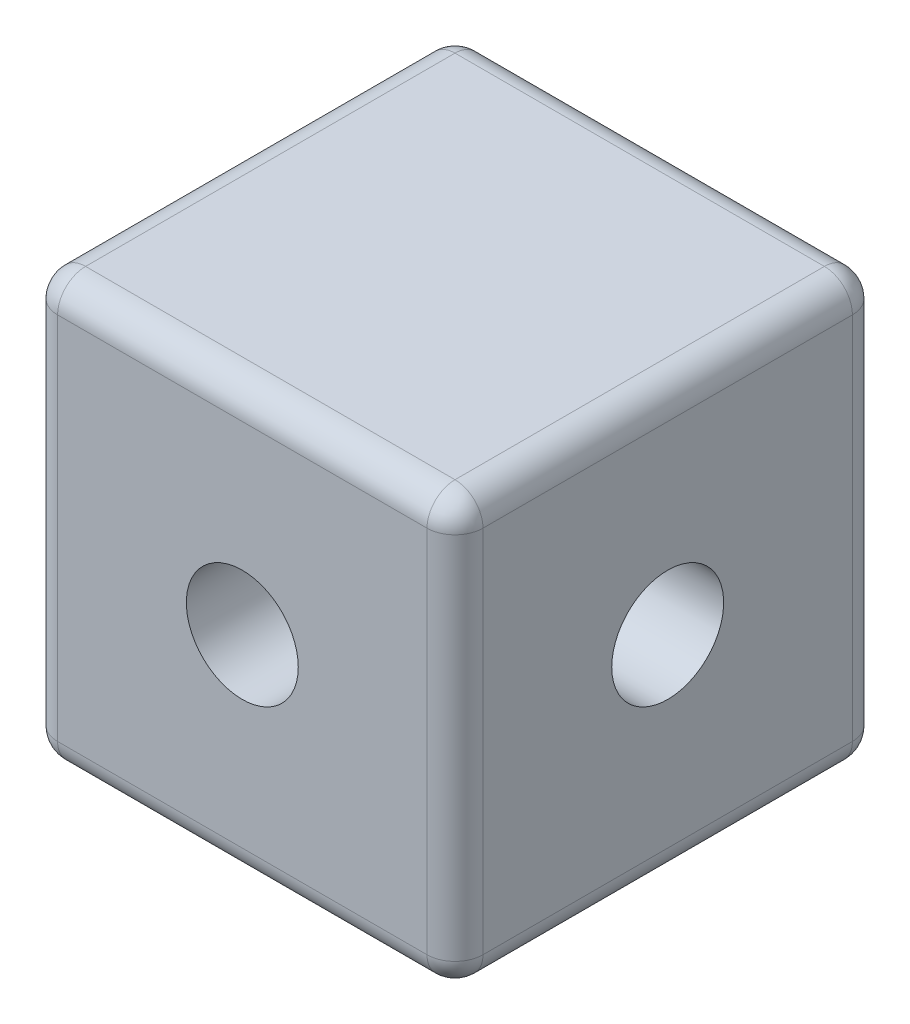
ISO-10303-21;
HEADER;
FILE_DESCRIPTION(('STEP AP214'),'2;1');
FILE_NAME('part.step','',(''),(''),'','','');
FILE_SCHEMA(('AUTOMOTIVE_DESIGN { 1 0 10303 214 1 1 1 1 }'));
ENDSEC;
DATA;
#1=APPLICATION_CONTEXT('core data for automotive mechanical design processes');
#2=APPLICATION_PROTOCOL_DEFINITION('international standard','automotive_design',2000,#1);
#3=PRODUCT_CONTEXT('',#1,'mechanical');
#4=PRODUCT('Part','Part','',(#3));
#5=PRODUCT_RELATED_PRODUCT_CATEGORY('part','',(#4));
#6=PRODUCT_DEFINITION_FORMATION('','',#4);
#7=PRODUCT_DEFINITION_CONTEXT('part definition',#1,'design');
#8=PRODUCT_DEFINITION('design','',#6,#7);
#9=PRODUCT_DEFINITION_SHAPE('','',#8);
#10=(LENGTH_UNIT() NAMED_UNIT(*) SI_UNIT(.MILLI.,.METRE.));
#11=(NAMED_UNIT(*) PLANE_ANGLE_UNIT() SI_UNIT($,.RADIAN.));
#12=(NAMED_UNIT(*) SI_UNIT($,.STERADIAN.) SOLID_ANGLE_UNIT());
#13=UNCERTAINTY_MEASURE_WITH_UNIT(LENGTH_MEASURE(1.E-05),#10,'distance_accuracy_value','');
#14=(GEOMETRIC_REPRESENTATION_CONTEXT(3) GLOBAL_UNCERTAINTY_ASSIGNED_CONTEXT((#13)) GLOBAL_UNIT_ASSIGNED_CONTEXT((#10,
#11,#12)) REPRESENTATION_CONTEXT('',''));
#15=CARTESIAN_POINT('',(0.,0.,0.));
#16=DIRECTION('',(0.,0.,1.));
#17=DIRECTION('',(1.,0.,0.));
#18=AXIS2_PLACEMENT_3D('',#15,#16,#17);
#19=CARTESIAN_POINT('',(6.2,3.8,0.));
#20=DIRECTION('',(-1.,0.,0.));
#21=DIRECTION('',(0.,0.,1.));
#22=AXIS2_PLACEMENT_3D('',#19,#20,#21);
#23=CYLINDRICAL_SURFACE('',#22,1.);
#24=CARTESIAN_POINT('',(-3.8,3.8,0.));
#25=DIRECTION('',(-1.,0.,0.));
#26=DIRECTION('',(0.,0.,1.));
#27=AXIS2_PLACEMENT_3D('',#24,#25,#26);
#28=CIRCLE('',#27,1.);
#29=CARTESIAN_POINT('',(-3.8,3.8,1.));
#30=VERTEX_POINT('',#29);
#31=EDGE_CURVE('E327',#30,#30,#28,.T.);
#32=ORIENTED_EDGE('',*,*,#31,.T.);
#33=EDGE_LOOP('',(#32));
#34=FACE_BOUND('',#33,.T.);
#35=CARTESIAN_POINT('',(0.,3.8,0.));
#36=DIRECTION('',(-0.707106781186547,0.,-0.707106781186547));
#37=DIRECTION('',(-0.707106781186547,0.,0.707106781186547));
#38=AXIS2_PLACEMENT_3D('',#35,#36,#37);
#39=ELLIPSE('',#38,1.41421356237309,1.);
#40=CARTESIAN_POINT('',(0.,4.8,0.));
#41=VERTEX_POINT('',#40);
#42=CARTESIAN_POINT('',(0.,2.8,0.));
#43=VERTEX_POINT('',#42);
#44=EDGE_CURVE('E59',#41,#43,#39,.F.);
#45=ORIENTED_EDGE('',*,*,#44,.T.);
#46=CARTESIAN_POINT('',(0.,3.8,0.));
#47=DIRECTION('',(-0.707106781186547,0.,0.707106781186547));
#48=DIRECTION('',(-0.707106781186547,0.,-0.707106781186547));
#49=AXIS2_PLACEMENT_3D('',#46,#47,#48);
#50=ELLIPSE('',#49,1.41421356237309,1.);
#51=EDGE_CURVE('E11',#43,#41,#50,.F.);
#52=ORIENTED_EDGE('',*,*,#51,.T.);
#53=EDGE_LOOP('',(#45,#52));
#54=FACE_BOUND('',#53,.T.);
#55=ADVANCED_FACE('F45',(#34,#54),#23,.F.);
#56=CARTESIAN_POINT('',(3.8,7.6,3.8));
#57=DIRECTION('',(-1.,0.,0.));
#58=DIRECTION('',(0.,0.,1.));
#59=AXIS2_PLACEMENT_3D('',#56,#57,#58);
#60=PLANE('',#59);
#61=CARTESIAN_POINT('',(3.8,3.8,0.));
#62=DIRECTION('',(-1.,0.,0.));
#63=DIRECTION('',(0.,0.,1.));
#64=AXIS2_PLACEMENT_3D('',#61,#62,#63);
#65=CIRCLE('',#64,1.);
#66=CARTESIAN_POINT('',(3.8,3.8,1.));
#67=VERTEX_POINT('',#66);
#68=EDGE_CURVE('E249',#67,#67,#65,.T.);
#69=ORIENTED_EDGE('',*,*,#68,.T.);
#70=EDGE_LOOP('',(#69));
#71=FACE_BOUND('',#70,.T.);
#72=DIRECTION('',(0.,-1.,0.));
#73=VECTOR('',#72,1.);
#74=CARTESIAN_POINT('',(3.8,7.6,3.3));
#75=LINE('',#74,#73);
#76=CARTESIAN_POINT('',(3.8,7.1,3.3));
#77=VERTEX_POINT('',#76);
#78=CARTESIAN_POINT('',(3.8,0.5,3.3));
#79=VERTEX_POINT('',#78);
#80=EDGE_CURVE('E161',#77,#79,#75,.T.);
#81=ORIENTED_EDGE('',*,*,#80,.T.);
#82=DIRECTION('',(0.,0.,-1.));
#83=VECTOR('',#82,1.);
#84=CARTESIAN_POINT('',(3.8,0.5,-3.8));
#85=LINE('',#84,#83);
#86=CARTESIAN_POINT('',(3.8,0.5,-3.3));
#87=VERTEX_POINT('',#86);
#88=EDGE_CURVE('E312',#79,#87,#85,.T.);
#89=ORIENTED_EDGE('',*,*,#88,.T.);
#90=DIRECTION('',(0.,-1.,0.));
#91=VECTOR('',#90,1.);
#92=CARTESIAN_POINT('',(3.8,7.6,-3.3));
#93=LINE('',#92,#91);
#94=CARTESIAN_POINT('',(3.8,7.1,-3.3));
#95=VERTEX_POINT('',#94);
#96=EDGE_CURVE('E316',#87,#95,#93,.F.);
#97=ORIENTED_EDGE('',*,*,#96,.T.);
#98=DIRECTION('',(0.,0.,-1.));
#99=VECTOR('',#98,1.);
#100=CARTESIAN_POINT('',(3.8,7.1,3.8));
#101=LINE('',#100,#99);
#102=EDGE_CURVE('E319',#95,#77,#101,.F.);
#103=ORIENTED_EDGE('',*,*,#102,.T.);
#104=EDGE_LOOP('',(#81,#89,#97,#103));
#105=FACE_BOUND('',#104,.T.);
#106=ADVANCED_FACE('F360',(#71,#105),#60,.F.);
#107=CARTESIAN_POINT('',(-3.8,7.6,-3.8));
#108=DIRECTION('',(0.,0.,1.));
#109=DIRECTION('',(1.,0.,0.));
#110=AXIS2_PLACEMENT_3D('',#107,#108,#109);
#111=PLANE('',#110);
#112=CARTESIAN_POINT('',(0.,3.8,-3.8));
#113=DIRECTION('',(0.,0.,1.));
#114=DIRECTION('',(1.,0.,0.));
#115=AXIS2_PLACEMENT_3D('',#112,#113,#114);
#116=CIRCLE('',#115,1.);
#117=CARTESIAN_POINT('',(1.,3.8,-3.8));
#118=VERTEX_POINT('',#117);
#119=EDGE_CURVE('E331',#118,#118,#116,.F.);
#120=ORIENTED_EDGE('',*,*,#119,.F.);
#121=EDGE_LOOP('',(#120));
#122=FACE_BOUND('',#121,.T.);
#123=DIRECTION('',(0.,-1.,0.));
#124=VECTOR('',#123,1.);
#125=CARTESIAN_POINT('',(3.3,7.6,-3.8));
#126=LINE('',#125,#124);
#127=CARTESIAN_POINT('',(3.3,7.1,-3.8));
#128=VERTEX_POINT('',#127);
#129=CARTESIAN_POINT('',(3.3,0.5,-3.8));
#130=VERTEX_POINT('',#129);
#131=EDGE_CURVE('E276',#128,#130,#126,.T.);
#132=ORIENTED_EDGE('',*,*,#131,.T.);
#133=DIRECTION('',(-1.,0.,0.));
#134=VECTOR('',#133,1.);
#135=CARTESIAN_POINT('',(-3.8,0.5,-3.8));
#136=LINE('',#135,#134);
#137=CARTESIAN_POINT('',(-3.3,0.5,-3.8));
#138=VERTEX_POINT('',#137);
#139=EDGE_CURVE('E273',#130,#138,#136,.T.);
#140=ORIENTED_EDGE('',*,*,#139,.T.);
#141=DIRECTION('',(0.,-1.,0.));
#142=VECTOR('',#141,1.);
#143=CARTESIAN_POINT('',(-3.3,7.6,-3.8));
#144=LINE('',#143,#142);
#145=CARTESIAN_POINT('',(-3.3,7.1,-3.8));
#146=VERTEX_POINT('',#145);
#147=EDGE_CURVE('E280',#138,#146,#144,.F.);
#148=ORIENTED_EDGE('',*,*,#147,.T.);
#149=DIRECTION('',(-1.,0.,0.));
#150=VECTOR('',#149,1.);
#151=CARTESIAN_POINT('',(-3.8,7.1,-3.8));
#152=LINE('',#151,#150);
#153=EDGE_CURVE('E283',#146,#128,#152,.F.);
#154=ORIENTED_EDGE('',*,*,#153,.T.);
#155=EDGE_LOOP('',(#132,#140,#148,#154));
#156=FACE_BOUND('',#155,.T.);
#157=ADVANCED_FACE('F355',(#122,#156),#111,.F.);
#158=CARTESIAN_POINT('',(-3.8,7.6,3.8));
#159=DIRECTION('',(1.,0.,0.));
#160=DIRECTION('',(0.,0.,-1.));
#161=AXIS2_PLACEMENT_3D('',#158,#159,#160);
#162=PLANE('',#161);
#163=ORIENTED_EDGE('',*,*,#31,.F.);
#164=EDGE_LOOP('',(#163));
#165=FACE_BOUND('',#164,.T.);
#166=DIRECTION('',(0.,-1.,0.));
#167=VECTOR('',#166,1.);
#168=CARTESIAN_POINT('',(-3.8,7.6,-3.3));
#169=LINE('',#168,#167);
#170=CARTESIAN_POINT('',(-3.8,7.1,-3.3));
#171=VERTEX_POINT('',#170);
#172=CARTESIAN_POINT('',(-3.8,0.5,-3.3));
#173=VERTEX_POINT('',#172);
#174=EDGE_CURVE('E290',#171,#173,#169,.T.);
#175=ORIENTED_EDGE('',*,*,#174,.T.);
#176=DIRECTION('',(0.,0.,1.));
#177=VECTOR('',#176,1.);
#178=CARTESIAN_POINT('',(-3.8,0.5,3.8));
#179=LINE('',#178,#177);
#180=CARTESIAN_POINT('',(-3.8,0.5,3.3));
#181=VERTEX_POINT('',#180);
#182=EDGE_CURVE('E286',#173,#181,#179,.T.);
#183=ORIENTED_EDGE('',*,*,#182,.T.);
#184=DIRECTION('',(0.,-1.,0.));
#185=VECTOR('',#184,1.);
#186=CARTESIAN_POINT('',(-3.8,7.6,3.3));
#187=LINE('',#186,#185);
#188=CARTESIAN_POINT('',(-3.8,7.1,3.3));
#189=VERTEX_POINT('',#188);
#190=EDGE_CURVE('E296',#181,#189,#187,.F.);
#191=ORIENTED_EDGE('',*,*,#190,.T.);
#192=DIRECTION('',(0.,0.,1.));
#193=VECTOR('',#192,1.);
#194=CARTESIAN_POINT('',(-3.8,7.1,3.8));
#195=LINE('',#194,#193);
#196=EDGE_CURVE('E293',#189,#171,#195,.F.);
#197=ORIENTED_EDGE('',*,*,#196,.T.);
#198=EDGE_LOOP('',(#175,#183,#191,#197));
#199=FACE_BOUND('',#198,.T.);
#200=ADVANCED_FACE('F344',(#165,#199),#162,.F.);
#201=CARTESIAN_POINT('',(-3.8,7.6,3.8));
#202=DIRECTION('',(0.,0.,-1.));
#203=DIRECTION('',(-1.,0.,0.));
#204=AXIS2_PLACEMENT_3D('',#201,#202,#203);
#205=PLANE('',#204);
#206=CARTESIAN_POINT('',(0.,3.8,3.8));
#207=DIRECTION('',(0.,0.,1.));
#208=DIRECTION('',(1.,0.,0.));
#209=AXIS2_PLACEMENT_3D('',#206,#207,#208);
#210=CIRCLE('',#209,1.);
#211=CARTESIAN_POINT('',(1.,3.8,3.8));
#212=VERTEX_POINT('',#211);
#213=EDGE_CURVE('E335',#212,#212,#210,.T.);
#214=ORIENTED_EDGE('',*,*,#213,.F.);
#215=EDGE_LOOP('',(#214));
#216=FACE_BOUND('',#215,.T.);
#217=DIRECTION('',(1.,0.,0.));
#218=VECTOR('',#217,1.);
#219=CARTESIAN_POINT('',(-3.8,7.1,3.8));
#220=LINE('',#219,#218);
#221=CARTESIAN_POINT('',(3.3,7.1,3.8));
#222=VERTEX_POINT('',#221);
#223=CARTESIAN_POINT('',(-3.3,7.1,3.8));
#224=VERTEX_POINT('',#223);
#225=EDGE_CURVE('E67',#222,#224,#220,.F.);
#226=ORIENTED_EDGE('',*,*,#225,.T.);
#227=DIRECTION('',(0.,-1.,0.));
#228=VECTOR('',#227,1.);
#229=CARTESIAN_POINT('',(-3.3,7.6,3.8));
#230=LINE('',#229,#228);
#231=CARTESIAN_POINT('',(-3.3,0.5,3.8));
#232=VERTEX_POINT('',#231);
#233=EDGE_CURVE('E151',#224,#232,#230,.T.);
#234=ORIENTED_EDGE('',*,*,#233,.T.);
#235=DIRECTION('',(1.,0.,0.));
#236=VECTOR('',#235,1.);
#237=CARTESIAN_POINT('',(3.8,0.5,3.8));
#238=LINE('',#237,#236);
#239=CARTESIAN_POINT('',(3.3,0.5,3.8));
#240=VERTEX_POINT('',#239);
#241=EDGE_CURVE('E257',#232,#240,#238,.T.);
#242=ORIENTED_EDGE('',*,*,#241,.T.);
#243=DIRECTION('',(0.,-1.,0.));
#244=VECTOR('',#243,1.);
#245=CARTESIAN_POINT('',(3.3,7.6,3.8));
#246=LINE('',#245,#244);
#247=EDGE_CURVE('E254',#240,#222,#246,.F.);
#248=ORIENTED_EDGE('',*,*,#247,.T.);
#249=EDGE_LOOP('',(#226,#234,#242,#248));
#250=FACE_BOUND('',#249,.T.);
#251=ADVANCED_FACE('F341',(#216,#250),#205,.F.);
#252=CARTESIAN_POINT('',(0.,7.6,0.));
#253=DIRECTION('',(0.,-1.,0.));
#254=DIRECTION('',(0.,0.,-1.));
#255=AXIS2_PLACEMENT_3D('',#252,#253,#254);
#256=PLANE('',#255);
#257=DIRECTION('',(-1.,0.,0.));
#258=VECTOR('',#257,1.);
#259=CARTESIAN_POINT('',(0.,7.6,-3.3));
#260=LINE('',#259,#258);
#261=CARTESIAN_POINT('',(3.3,7.6,-3.3));
#262=VERTEX_POINT('',#261);
#263=CARTESIAN_POINT('',(-3.3,7.6,-3.3));
#264=VERTEX_POINT('',#263);
#265=EDGE_CURVE('E264',#262,#264,#260,.T.);
#266=ORIENTED_EDGE('',*,*,#265,.T.);
#267=DIRECTION('',(0.,0.,1.));
#268=VECTOR('',#267,1.);
#269=CARTESIAN_POINT('',(-3.3,7.6,0.));
#270=LINE('',#269,#268);
#271=CARTESIAN_POINT('',(-3.3,7.6,3.3));
#272=VERTEX_POINT('',#271);
#273=EDGE_CURVE('E260',#264,#272,#270,.T.);
#274=ORIENTED_EDGE('',*,*,#273,.T.);
#275=DIRECTION('',(1.,0.,0.));
#276=VECTOR('',#275,1.);
#277=CARTESIAN_POINT('',(0.,7.6,3.3));
#278=LINE('',#277,#276);
#279=CARTESIAN_POINT('',(3.3,7.6,3.3));
#280=VERTEX_POINT('',#279);
#281=EDGE_CURVE('E270',#272,#280,#278,.T.);
#282=ORIENTED_EDGE('',*,*,#281,.T.);
#283=DIRECTION('',(0.,0.,-1.));
#284=VECTOR('',#283,1.);
#285=CARTESIAN_POINT('',(3.3,7.6,0.));
#286=LINE('',#285,#284);
#287=EDGE_CURVE('E267',#280,#262,#286,.T.);
#288=ORIENTED_EDGE('',*,*,#287,.T.);
#289=EDGE_LOOP('',(#266,#274,#282,#288));
#290=FACE_BOUND('',#289,.T.);
#291=ADVANCED_FACE('F343',(#290),#256,.F.);
#292=CARTESIAN_POINT('',(0.,0.,0.));
#293=DIRECTION('',(0.,-1.,0.));
#294=DIRECTION('',(0.,0.,-1.));
#295=AXIS2_PLACEMENT_3D('',#292,#293,#294);
#296=PLANE('',#295);
#297=DIRECTION('',(0.,0.,1.));
#298=VECTOR('',#297,1.);
#299=CARTESIAN_POINT('',(-3.3,0.,-3.8));
#300=LINE('',#299,#298);
#301=CARTESIAN_POINT('',(-3.3,0.,3.3));
#302=VERTEX_POINT('',#301);
#303=CARTESIAN_POINT('',(-3.3,0.,-3.3));
#304=VERTEX_POINT('',#303);
#305=EDGE_CURVE('E306',#302,#304,#300,.F.);
#306=ORIENTED_EDGE('',*,*,#305,.T.);
#307=DIRECTION('',(-1.,0.,0.));
#308=VECTOR('',#307,1.);
#309=CARTESIAN_POINT('',(3.8,0.,-3.3));
#310=LINE('',#309,#308);
#311=CARTESIAN_POINT('',(3.3,0.,-3.3));
#312=VERTEX_POINT('',#311);
#313=EDGE_CURVE('E299',#304,#312,#310,.F.);
#314=ORIENTED_EDGE('',*,*,#313,.T.);
#315=DIRECTION('',(0.,0.,-1.));
#316=VECTOR('',#315,1.);
#317=CARTESIAN_POINT('',(3.3,0.,3.8));
#318=LINE('',#317,#316);
#319=CARTESIAN_POINT('',(3.3,0.,3.3));
#320=VERTEX_POINT('',#319);
#321=EDGE_CURVE('E302',#312,#320,#318,.F.);
#322=ORIENTED_EDGE('',*,*,#321,.T.);
#323=DIRECTION('',(1.,0.,0.));
#324=VECTOR('',#323,1.);
#325=CARTESIAN_POINT('',(-3.8,0.,3.3));
#326=LINE('',#325,#324);
#327=EDGE_CURVE('E309',#320,#302,#326,.F.);
#328=ORIENTED_EDGE('',*,*,#327,.T.);
#329=EDGE_LOOP('',(#306,#314,#322,#328));
#330=FACE_BOUND('',#329,.T.);
#331=ADVANCED_FACE('F351',(#330),#296,.T.);
#332=CARTESIAN_POINT('',(-3.3,7.1,0.));
#333=DIRECTION('',(0.,0.,1.));
#334=DIRECTION('',(1.,0.,0.));
#335=AXIS2_PLACEMENT_3D('',#332,#333,#334);
#336=CYLINDRICAL_SURFACE('',#335,0.5);
#337=CARTESIAN_POINT('',(-3.3,7.1,3.3));
#338=DIRECTION('',(0.,0.,1.));
#339=DIRECTION('',(1.,0.,0.));
#340=AXIS2_PLACEMENT_3D('',#337,#338,#339);
#341=CIRCLE('',#340,0.5);
#342=EDGE_CURVE('E157',#272,#189,#341,.T.);
#343=ORIENTED_EDGE('',*,*,#342,.F.);
#344=ORIENTED_EDGE('',*,*,#273,.F.);
#345=CARTESIAN_POINT('',(-3.3,7.1,-3.3));
#346=DIRECTION('',(0.,0.,-1.));
#347=DIRECTION('',(0.,1.,0.));
#348=AXIS2_PLACEMENT_3D('',#345,#346,#347);
#349=CIRCLE('',#348,0.5);
#350=EDGE_CURVE('E162',#171,#264,#349,.T.);
#351=ORIENTED_EDGE('',*,*,#350,.F.);
#352=ORIENTED_EDGE('',*,*,#196,.F.);
#353=EDGE_LOOP('',(#343,#344,#351,#352));
#354=FACE_BOUND('',#353,.T.);
#355=ADVANCED_FACE('F47',(#354),#336,.T.);
#356=CARTESIAN_POINT('',(-3.3,7.1,3.3));
#357=DIRECTION('',(-1.,0.,0.));
#358=DIRECTION('',(0.,0.,1.));
#359=AXIS2_PLACEMENT_3D('',#356,#357,#358);
#360=SPHERICAL_SURFACE('',#359,0.5);
#361=CARTESIAN_POINT('',(-3.3,7.1,3.3));
#362=DIRECTION('',(-1.,0.,0.));
#363=DIRECTION('',(0.,0.,1.));
#364=AXIS2_PLACEMENT_3D('',#361,#362,#363);
#365=CIRCLE('',#364,0.5);
#366=EDGE_CURVE('E170',#272,#224,#365,.F.);
#367=ORIENTED_EDGE('',*,*,#366,.F.);
#368=ORIENTED_EDGE('',*,*,#342,.T.);
#369=CARTESIAN_POINT('',(-3.3,7.1,3.3));
#370=DIRECTION('',(0.,1.,0.));
#371=DIRECTION('',(0.,0.,1.));
#372=AXIS2_PLACEMENT_3D('',#369,#370,#371);
#373=CIRCLE('',#372,0.5);
#374=EDGE_CURVE('E166',#224,#189,#373,.F.);
#375=ORIENTED_EDGE('',*,*,#374,.F.);
#376=EDGE_LOOP('',(#367,#368,#375));
#377=FACE_BOUND('',#376,.T.);
#378=ADVANCED_FACE('F446',(#377),#360,.T.);
#379=CARTESIAN_POINT('',(-3.3,7.1,-3.3));
#380=DIRECTION('',(0.,1.,0.));
#381=DIRECTION('',(0.,0.,1.));
#382=AXIS2_PLACEMENT_3D('',#379,#380,#381);
#383=SPHERICAL_SURFACE('',#382,0.5);
#384=CARTESIAN_POINT('',(-3.3,7.1,-3.3));
#385=DIRECTION('',(0.,1.,0.));
#386=DIRECTION('',(0.,0.,1.));
#387=AXIS2_PLACEMENT_3D('',#384,#385,#386);
#388=CIRCLE('',#387,0.5);
#389=EDGE_CURVE('E177',#171,#146,#388,.F.);
#390=ORIENTED_EDGE('',*,*,#389,.F.);
#391=ORIENTED_EDGE('',*,*,#350,.T.);
#392=CARTESIAN_POINT('',(-3.3,7.1,-3.3));
#393=DIRECTION('',(-1.,0.,0.));
#394=DIRECTION('',(0.,0.,1.));
#395=AXIS2_PLACEMENT_3D('',#392,#393,#394);
#396=CIRCLE('',#395,0.5);
#397=EDGE_CURVE('E173',#146,#264,#396,.F.);
#398=ORIENTED_EDGE('',*,*,#397,.F.);
#399=EDGE_LOOP('',(#390,#391,#398));
#400=FACE_BOUND('',#399,.T.);
#401=ADVANCED_FACE('F443',(#400),#383,.T.);
#402=CARTESIAN_POINT('',(-3.3,7.6,3.3));
#403=DIRECTION('',(0.,-1.,0.));
#404=DIRECTION('',(0.,0.,-1.));
#405=AXIS2_PLACEMENT_3D('',#402,#403,#404);
#406=CYLINDRICAL_SURFACE('',#405,0.5);
#407=ORIENTED_EDGE('',*,*,#374,.T.);
#408=ORIENTED_EDGE('',*,*,#190,.F.);
#409=CARTESIAN_POINT('',(-3.3,0.5,3.3));
#410=DIRECTION('',(0.,-1.,0.));
#411=DIRECTION('',(0.,0.,-1.));
#412=AXIS2_PLACEMENT_3D('',#409,#410,#411);
#413=CIRCLE('',#412,0.5);
#414=EDGE_CURVE('E185',#232,#181,#413,.T.);
#415=ORIENTED_EDGE('',*,*,#414,.F.);
#416=ORIENTED_EDGE('',*,*,#233,.F.);
#417=EDGE_LOOP('',(#407,#408,#415,#416));
#418=FACE_BOUND('',#417,.T.);
#419=ADVANCED_FACE('F439',(#418),#406,.T.);
#420=CARTESIAN_POINT('',(0.,7.1,3.3));
#421=DIRECTION('',(1.,0.,0.));
#422=DIRECTION('',(0.,0.,-1.));
#423=AXIS2_PLACEMENT_3D('',#420,#421,#422);
#424=CYLINDRICAL_SURFACE('',#423,0.5);
#425=ORIENTED_EDGE('',*,*,#366,.T.);
#426=ORIENTED_EDGE('',*,*,#225,.F.);
#427=CARTESIAN_POINT('',(3.3,7.1,3.3));
#428=DIRECTION('',(1.,0.,0.));
#429=DIRECTION('',(0.,0.,-1.));
#430=AXIS2_PLACEMENT_3D('',#427,#428,#429);
#431=CIRCLE('',#430,0.5);
#432=EDGE_CURVE('E188',#280,#222,#431,.T.);
#433=ORIENTED_EDGE('',*,*,#432,.F.);
#434=ORIENTED_EDGE('',*,*,#281,.F.);
#435=EDGE_LOOP('',(#425,#426,#433,#434));
#436=FACE_BOUND('',#435,.T.);
#437=ADVANCED_FACE('F435',(#436),#424,.T.);
#438=CARTESIAN_POINT('',(3.3,7.1,0.));
#439=DIRECTION('',(0.,0.,-1.));
#440=DIRECTION('',(-1.,0.,0.));
#441=AXIS2_PLACEMENT_3D('',#438,#439,#440);
#442=CYLINDRICAL_SURFACE('',#441,0.5);
#443=CARTESIAN_POINT('',(3.3,7.1,-3.3));
#444=DIRECTION('',(0.,0.,-1.));
#445=DIRECTION('',(-1.,0.,0.));
#446=AXIS2_PLACEMENT_3D('',#443,#444,#445);
#447=CIRCLE('',#446,0.5);
#448=EDGE_CURVE('E196',#262,#95,#447,.T.);
#449=ORIENTED_EDGE('',*,*,#448,.F.);
#450=ORIENTED_EDGE('',*,*,#287,.F.);
#451=CARTESIAN_POINT('',(3.3,7.1,3.3));
#452=DIRECTION('',(0.,0.,1.));
#453=DIRECTION('',(1.,0.,0.));
#454=AXIS2_PLACEMENT_3D('',#451,#452,#453);
#455=CIRCLE('',#454,0.5);
#456=EDGE_CURVE('E192',#77,#280,#455,.T.);
#457=ORIENTED_EDGE('',*,*,#456,.F.);
#458=ORIENTED_EDGE('',*,*,#102,.F.);
#459=EDGE_LOOP('',(#449,#450,#457,#458));
#460=FACE_BOUND('',#459,.T.);
#461=ADVANCED_FACE('F431',(#460),#442,.T.);
#462=CARTESIAN_POINT('',(0.,7.1,-3.3));
#463=DIRECTION('',(-1.,0.,0.));
#464=DIRECTION('',(0.,0.,1.));
#465=AXIS2_PLACEMENT_3D('',#462,#463,#464);
#466=CYLINDRICAL_SURFACE('',#465,0.5);
#467=ORIENTED_EDGE('',*,*,#397,.T.);
#468=ORIENTED_EDGE('',*,*,#265,.F.);
#469=CARTESIAN_POINT('',(3.3,7.1,-3.3));
#470=DIRECTION('',(1.,0.,0.));
#471=DIRECTION('',(0.,1.,0.));
#472=AXIS2_PLACEMENT_3D('',#469,#470,#471);
#473=CIRCLE('',#472,0.5);
#474=EDGE_CURVE('E200',#128,#262,#473,.T.);
#475=ORIENTED_EDGE('',*,*,#474,.F.);
#476=ORIENTED_EDGE('',*,*,#153,.F.);
#477=EDGE_LOOP('',(#467,#468,#475,#476));
#478=FACE_BOUND('',#477,.T.);
#479=ADVANCED_FACE('F427',(#478),#466,.T.);
#480=CARTESIAN_POINT('',(-3.3,7.6,-3.3));
#481=DIRECTION('',(0.,-1.,0.));
#482=DIRECTION('',(0.,0.,-1.));
#483=AXIS2_PLACEMENT_3D('',#480,#481,#482);
#484=CYLINDRICAL_SURFACE('',#483,0.5);
#485=ORIENTED_EDGE('',*,*,#389,.T.);
#486=ORIENTED_EDGE('',*,*,#147,.F.);
#487=CARTESIAN_POINT('',(-3.3,0.5,-3.3));
#488=DIRECTION('',(0.,-1.,0.));
#489=DIRECTION('',(0.,0.,-1.));
#490=AXIS2_PLACEMENT_3D('',#487,#488,#489);
#491=CIRCLE('',#490,0.5);
#492=EDGE_CURVE('E204',#173,#138,#491,.T.);
#493=ORIENTED_EDGE('',*,*,#492,.F.);
#494=ORIENTED_EDGE('',*,*,#174,.F.);
#495=EDGE_LOOP('',(#485,#486,#493,#494));
#496=FACE_BOUND('',#495,.T.);
#497=ADVANCED_FACE('F423',(#496),#484,.T.);
#498=CARTESIAN_POINT('',(-3.3,0.5,3.8));
#499=DIRECTION('',(0.,0.,-1.));
#500=DIRECTION('',(-1.,0.,0.));
#501=AXIS2_PLACEMENT_3D('',#498,#499,#500);
#502=CYLINDRICAL_SURFACE('',#501,0.5);
#503=CARTESIAN_POINT('',(-3.3,0.5,3.3));
#504=DIRECTION('',(0.,0.,1.));
#505=DIRECTION('',(1.,0.,0.));
#506=AXIS2_PLACEMENT_3D('',#503,#504,#505);
#507=CIRCLE('',#506,0.5);
#508=EDGE_CURVE('E181',#181,#302,#507,.T.);
#509=ORIENTED_EDGE('',*,*,#508,.F.);
#510=ORIENTED_EDGE('',*,*,#182,.F.);
#511=CARTESIAN_POINT('',(-3.3,0.5,-3.3));
#512=DIRECTION('',(0.,0.,-1.));
#513=DIRECTION('',(-1.,0.,0.));
#514=AXIS2_PLACEMENT_3D('',#511,#512,#513);
#515=CIRCLE('',#514,0.5);
#516=EDGE_CURVE('E208',#304,#173,#515,.T.);
#517=ORIENTED_EDGE('',*,*,#516,.F.);
#518=ORIENTED_EDGE('',*,*,#305,.F.);
#519=EDGE_LOOP('',(#509,#510,#517,#518));
#520=FACE_BOUND('',#519,.T.);
#521=ADVANCED_FACE('F419',(#520),#502,.T.);
#522=CARTESIAN_POINT('',(-3.3,0.5,3.3));
#523=DIRECTION('',(-1.,0.,0.));
#524=DIRECTION('',(0.,-1.,0.));
#525=AXIS2_PLACEMENT_3D('',#522,#523,#524);
#526=SPHERICAL_SURFACE('',#525,0.5);
#527=ORIENTED_EDGE('',*,*,#414,.T.);
#528=ORIENTED_EDGE('',*,*,#508,.T.);
#529=CARTESIAN_POINT('',(-3.3,0.5,3.3));
#530=DIRECTION('',(-1.,0.,0.));
#531=DIRECTION('',(0.,0.,1.));
#532=AXIS2_PLACEMENT_3D('',#529,#530,#531);
#533=CIRCLE('',#532,0.5);
#534=EDGE_CURVE('E212',#232,#302,#533,.F.);
#535=ORIENTED_EDGE('',*,*,#534,.F.);
#536=EDGE_LOOP('',(#527,#528,#535));
#537=FACE_BOUND('',#536,.T.);
#538=ADVANCED_FACE('F415',(#537),#526,.T.);
#539=CARTESIAN_POINT('',(3.3,7.1,3.3));
#540=DIRECTION('',(0.,1.,0.));
#541=DIRECTION('',(0.,0.,1.));
#542=AXIS2_PLACEMENT_3D('',#539,#540,#541);
#543=SPHERICAL_SURFACE('',#542,0.5);
#544=ORIENTED_EDGE('',*,*,#456,.T.);
#545=ORIENTED_EDGE('',*,*,#432,.T.);
#546=CARTESIAN_POINT('',(3.3,7.1,3.3));
#547=DIRECTION('',(0.,1.,0.));
#548=DIRECTION('',(0.,0.,1.));
#549=AXIS2_PLACEMENT_3D('',#546,#547,#548);
#550=CIRCLE('',#549,0.5);
#551=EDGE_CURVE('E216',#77,#222,#550,.F.);
#552=ORIENTED_EDGE('',*,*,#551,.F.);
#553=EDGE_LOOP('',(#544,#545,#552));
#554=FACE_BOUND('',#553,.T.);
#555=ADVANCED_FACE('F411',(#554),#543,.T.);
#556=CARTESIAN_POINT('',(3.3,7.1,-3.3));
#557=DIRECTION('',(0.,1.,0.));
#558=DIRECTION('',(0.,0.,1.));
#559=AXIS2_PLACEMENT_3D('',#556,#557,#558);
#560=SPHERICAL_SURFACE('',#559,0.5);
#561=ORIENTED_EDGE('',*,*,#474,.T.);
#562=ORIENTED_EDGE('',*,*,#448,.T.);
#563=CARTESIAN_POINT('',(3.3,7.1,-3.3));
#564=DIRECTION('',(0.,1.,0.));
#565=DIRECTION('',(0.,0.,1.));
#566=AXIS2_PLACEMENT_3D('',#563,#564,#565);
#567=CIRCLE('',#566,0.5);
#568=EDGE_CURVE('E220',#128,#95,#567,.F.);
#569=ORIENTED_EDGE('',*,*,#568,.F.);
#570=EDGE_LOOP('',(#561,#562,#569));
#571=FACE_BOUND('',#570,.T.);
#572=ADVANCED_FACE('F407',(#571),#560,.T.);
#573=CARTESIAN_POINT('',(-3.3,0.5,-3.3));
#574=DIRECTION('',(-1.,0.,0.));
#575=DIRECTION('',(0.,0.,1.));
#576=AXIS2_PLACEMENT_3D('',#573,#574,#575);
#577=SPHERICAL_SURFACE('',#576,0.5);
#578=ORIENTED_EDGE('',*,*,#516,.T.);
#579=ORIENTED_EDGE('',*,*,#492,.T.);
#580=CARTESIAN_POINT('',(-3.3,0.5,-3.3));
#581=DIRECTION('',(-1.,0.,0.));
#582=DIRECTION('',(0.,0.,1.));
#583=AXIS2_PLACEMENT_3D('',#580,#581,#582);
#584=CIRCLE('',#583,0.5);
#585=EDGE_CURVE('E224',#304,#138,#584,.F.);
#586=ORIENTED_EDGE('',*,*,#585,.F.);
#587=EDGE_LOOP('',(#578,#579,#586));
#588=FACE_BOUND('',#587,.T.);
#589=ADVANCED_FACE('F403',(#588),#577,.T.);
#590=CARTESIAN_POINT('',(-3.8,0.5,3.3));
#591=DIRECTION('',(-1.,0.,0.));
#592=DIRECTION('',(0.,0.,1.));
#593=AXIS2_PLACEMENT_3D('',#590,#591,#592);
#594=CYLINDRICAL_SURFACE('',#593,0.5);
#595=ORIENTED_EDGE('',*,*,#534,.T.);
#596=ORIENTED_EDGE('',*,*,#327,.F.);
#597=CARTESIAN_POINT('',(3.3,0.5,3.3));
#598=DIRECTION('',(1.,0.,0.));
#599=DIRECTION('',(0.,0.,-1.));
#600=AXIS2_PLACEMENT_3D('',#597,#598,#599);
#601=CIRCLE('',#600,0.5);
#602=EDGE_CURVE('E228',#240,#320,#601,.T.);
#603=ORIENTED_EDGE('',*,*,#602,.F.);
#604=ORIENTED_EDGE('',*,*,#241,.F.);
#605=EDGE_LOOP('',(#595,#596,#603,#604));
#606=FACE_BOUND('',#605,.T.);
#607=ADVANCED_FACE('F399',(#606),#594,.T.);
#608=CARTESIAN_POINT('',(3.3,7.6,3.3));
#609=DIRECTION('',(0.,-1.,0.));
#610=DIRECTION('',(0.,0.,-1.));
#611=AXIS2_PLACEMENT_3D('',#608,#609,#610);
#612=CYLINDRICAL_SURFACE('',#611,0.5);
#613=ORIENTED_EDGE('',*,*,#551,.T.);
#614=ORIENTED_EDGE('',*,*,#247,.F.);
#615=CARTESIAN_POINT('',(3.3,0.5,3.3));
#616=DIRECTION('',(0.,-1.,0.));
#617=DIRECTION('',(0.,0.,-1.));
#618=AXIS2_PLACEMENT_3D('',#615,#616,#617);
#619=CIRCLE('',#618,0.5);
#620=EDGE_CURVE('E232',#79,#240,#619,.T.);
#621=ORIENTED_EDGE('',*,*,#620,.F.);
#622=ORIENTED_EDGE('',*,*,#80,.F.);
#623=EDGE_LOOP('',(#613,#614,#621,#622));
#624=FACE_BOUND('',#623,.T.);
#625=ADVANCED_FACE('F395',(#624),#612,.T.);
#626=CARTESIAN_POINT('',(3.3,7.6,-3.3));
#627=DIRECTION('',(0.,-1.,0.));
#628=DIRECTION('',(0.,0.,-1.));
#629=AXIS2_PLACEMENT_3D('',#626,#627,#628);
#630=CYLINDRICAL_SURFACE('',#629,0.5);
#631=ORIENTED_EDGE('',*,*,#568,.T.);
#632=ORIENTED_EDGE('',*,*,#96,.F.);
#633=CARTESIAN_POINT('',(3.3,0.5,-3.3));
#634=DIRECTION('',(0.,-1.,0.));
#635=DIRECTION('',(0.,0.,-1.));
#636=AXIS2_PLACEMENT_3D('',#633,#634,#635);
#637=CIRCLE('',#636,0.5);
#638=EDGE_CURVE('E236',#130,#87,#637,.T.);
#639=ORIENTED_EDGE('',*,*,#638,.F.);
#640=ORIENTED_EDGE('',*,*,#131,.F.);
#641=EDGE_LOOP('',(#631,#632,#639,#640));
#642=FACE_BOUND('',#641,.T.);
#643=ADVANCED_FACE('F391',(#642),#630,.T.);
#644=CARTESIAN_POINT('',(-3.8,0.5,-3.3));
#645=DIRECTION('',(1.,0.,0.));
#646=DIRECTION('',(0.,0.,-1.));
#647=AXIS2_PLACEMENT_3D('',#644,#645,#646);
#648=CYLINDRICAL_SURFACE('',#647,0.5);
#649=ORIENTED_EDGE('',*,*,#585,.T.);
#650=ORIENTED_EDGE('',*,*,#139,.F.);
#651=CARTESIAN_POINT('',(3.3,0.5,-3.3));
#652=DIRECTION('',(1.,0.,0.));
#653=DIRECTION('',(0.,0.,-1.));
#654=AXIS2_PLACEMENT_3D('',#651,#652,#653);
#655=CIRCLE('',#654,0.5);
#656=EDGE_CURVE('E240',#312,#130,#655,.T.);
#657=ORIENTED_EDGE('',*,*,#656,.F.);
#658=ORIENTED_EDGE('',*,*,#313,.F.);
#659=EDGE_LOOP('',(#649,#650,#657,#658));
#660=FACE_BOUND('',#659,.T.);
#661=ADVANCED_FACE('F387',(#660),#648,.T.);
#662=CARTESIAN_POINT('',(3.3,0.5,3.3));
#663=DIRECTION('',(0.,0.,1.));
#664=DIRECTION('',(0.,-1.,0.));
#665=AXIS2_PLACEMENT_3D('',#662,#663,#664);
#666=SPHERICAL_SURFACE('',#665,0.5);
#667=ORIENTED_EDGE('',*,*,#620,.T.);
#668=ORIENTED_EDGE('',*,*,#602,.T.);
#669=CARTESIAN_POINT('',(3.3,0.5,3.3));
#670=DIRECTION('',(0.,0.,1.));
#671=DIRECTION('',(1.,0.,0.));
#672=AXIS2_PLACEMENT_3D('',#669,#670,#671);
#673=CIRCLE('',#672,0.5);
#674=EDGE_CURVE('E243',#79,#320,#673,.F.);
#675=ORIENTED_EDGE('',*,*,#674,.F.);
#676=EDGE_LOOP('',(#667,#668,#675));
#677=FACE_BOUND('',#676,.T.);
#678=ADVANCED_FACE('F380',(#677),#666,.T.);
#679=CARTESIAN_POINT('',(3.3,0.5,-3.3));
#680=DIRECTION('',(0.,0.,-1.));
#681=DIRECTION('',(-1.,0.,0.));
#682=AXIS2_PLACEMENT_3D('',#679,#680,#681);
#683=SPHERICAL_SURFACE('',#682,0.5);
#684=ORIENTED_EDGE('',*,*,#656,.T.);
#685=ORIENTED_EDGE('',*,*,#638,.T.);
#686=CARTESIAN_POINT('',(3.3,0.5,-3.3));
#687=DIRECTION('',(0.,0.,-1.));
#688=DIRECTION('',(-1.,0.,0.));
#689=AXIS2_PLACEMENT_3D('',#686,#687,#688);
#690=CIRCLE('',#689,0.5);
#691=EDGE_CURVE('E246',#312,#87,#690,.F.);
#692=ORIENTED_EDGE('',*,*,#691,.F.);
#693=EDGE_LOOP('',(#684,#685,#692));
#694=FACE_BOUND('',#693,.T.);
#695=ADVANCED_FACE('F374',(#694),#683,.T.);
#696=CARTESIAN_POINT('',(3.3,0.5,3.8));
#697=DIRECTION('',(0.,0.,1.));
#698=DIRECTION('',(1.,0.,0.));
#699=AXIS2_PLACEMENT_3D('',#696,#697,#698);
#700=CYLINDRICAL_SURFACE('',#699,0.5);
#701=ORIENTED_EDGE('',*,*,#674,.T.);
#702=ORIENTED_EDGE('',*,*,#321,.F.);
#703=ORIENTED_EDGE('',*,*,#691,.T.);
#704=ORIENTED_EDGE('',*,*,#88,.F.);
#705=EDGE_LOOP('',(#701,#702,#703,#704));
#706=FACE_BOUND('',#705,.T.);
#707=ADVANCED_FACE('F369',(#706),#700,.T.);
#708=CARTESIAN_POINT('',(0.,3.8,0.));
#709=DIRECTION('',(-0.707106781186547,0.,-0.707106781186547));
#710=DIRECTION('',(-0.707106781186547,0.,0.707106781186547));
#711=AXIS2_PLACEMENT_3D('',#708,#709,#710);
#712=ELLIPSE('',#711,1.41421356237309,1.);
#713=EDGE_CURVE('E142',#41,#43,#712,.T.);
#714=ORIENTED_EDGE('',*,*,#713,.T.);
#715=CARTESIAN_POINT('',(0.,3.8,0.));
#716=DIRECTION('',(-0.707106781186547,0.,0.707106781186547));
#717=DIRECTION('',(-0.707106781186547,0.,-0.707106781186547));
#718=AXIS2_PLACEMENT_3D('',#715,#716,#717);
#719=ELLIPSE('',#718,1.41421356237309,1.);
#720=EDGE_CURVE('E54',#43,#41,#719,.T.);
#721=ORIENTED_EDGE('',*,*,#720,.T.);
#722=EDGE_LOOP('',(#714,#721));
#723=FACE_BOUND('',#722,.T.);
#724=ORIENTED_EDGE('',*,*,#68,.F.);
#725=EDGE_LOOP('',(#724));
#726=FACE_BOUND('',#725,.T.);
#727=ADVANCED_FACE('F153',(#723,#726),#23,.F.);
#728=CARTESIAN_POINT('',(0.,3.8,-6.62842712474619));
#729=DIRECTION('',(0.,0.,1.));
#730=DIRECTION('',(1.,0.,0.));
#731=AXIS2_PLACEMENT_3D('',#728,#729,#730);
#732=CYLINDRICAL_SURFACE('',#731,1.);
#733=ORIENTED_EDGE('',*,*,#213,.T.);
#734=EDGE_LOOP('',(#733));
#735=FACE_BOUND('',#734,.T.);
#736=ORIENTED_EDGE('',*,*,#44,.F.);
#737=ORIENTED_EDGE('',*,*,#720,.F.);
#738=EDGE_LOOP('',(#736,#737));
#739=FACE_BOUND('',#738,.T.);
#740=ADVANCED_FACE('F149',(#735,#739),#732,.F.);
#741=ORIENTED_EDGE('',*,*,#119,.T.);
#742=EDGE_LOOP('',(#741));
#743=FACE_BOUND('',#742,.T.);
#744=ORIENTED_EDGE('',*,*,#713,.F.);
#745=ORIENTED_EDGE('',*,*,#51,.F.);
#746=EDGE_LOOP('',(#744,#745));
#747=FACE_BOUND('',#746,.T.);
#748=ADVANCED_FACE('F143',(#743,#747),#732,.F.);
#749=CLOSED_SHELL('',(#55,#106,#157,#200,#251,#291,#331,#355,#378,#401,#419,#437,#461,#479,#497,
#521,#538,#555,#572,#589,#607,#625,#643,#661,#678,#695,#707,#727,#740,#748));
#750=MANIFOLD_SOLID_BREP('B2',#749);
#751=ADVANCED_BREP_SHAPE_REPRESENTATION('',(#18,#750),#14);
#752=SHAPE_DEFINITION_REPRESENTATION(#9,#751);
ENDSEC;
END-ISO-10303-21;
